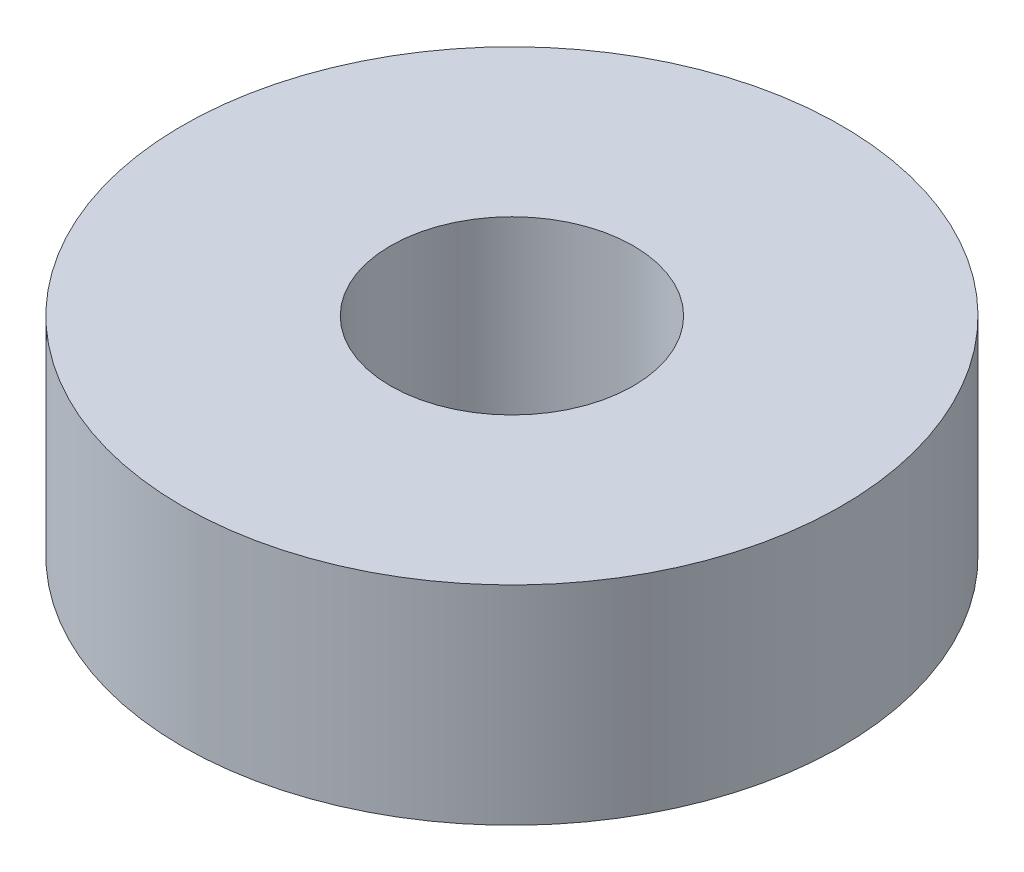
ISO-10303-21;
HEADER;
FILE_DESCRIPTION(('STEP AP214'),'2;1');
FILE_NAME('part.step','',(''),(''),'','','');
FILE_SCHEMA(('AUTOMOTIVE_DESIGN { 1 0 10303 214 1 1 1 1 }'));
ENDSEC;
DATA;
#1=APPLICATION_CONTEXT('core data for automotive mechanical design processes');
#2=APPLICATION_PROTOCOL_DEFINITION('international standard','automotive_design',2000,#1);
#3=PRODUCT_CONTEXT('',#1,'mechanical');
#4=PRODUCT('Part','Part','',(#3));
#5=PRODUCT_RELATED_PRODUCT_CATEGORY('part','',(#4));
#6=PRODUCT_DEFINITION_FORMATION('','',#4);
#7=PRODUCT_DEFINITION_CONTEXT('part definition',#1,'design');
#8=PRODUCT_DEFINITION('design','',#6,#7);
#9=PRODUCT_DEFINITION_SHAPE('','',#8);
#10=(LENGTH_UNIT() NAMED_UNIT(*) SI_UNIT(.MILLI.,.METRE.));
#11=(NAMED_UNIT(*) PLANE_ANGLE_UNIT() SI_UNIT($,.RADIAN.));
#12=(NAMED_UNIT(*) SI_UNIT($,.STERADIAN.) SOLID_ANGLE_UNIT());
#13=UNCERTAINTY_MEASURE_WITH_UNIT(LENGTH_MEASURE(1.E-05),#10,'distance_accuracy_value','');
#14=(GEOMETRIC_REPRESENTATION_CONTEXT(3) GLOBAL_UNCERTAINTY_ASSIGNED_CONTEXT((#13)) GLOBAL_UNIT_ASSIGNED_CONTEXT((#10,
#11,#12)) REPRESENTATION_CONTEXT('',''));
#15=CARTESIAN_POINT('',(0.,0.,0.));
#16=DIRECTION('',(0.,0.,1.));
#17=DIRECTION('',(1.,0.,0.));
#18=AXIS2_PLACEMENT_3D('',#15,#16,#17);
#19=CARTESIAN_POINT('',(0.,6.,0.));
#20=DIRECTION('',(0.,1.,0.));
#21=DIRECTION('',(0.,0.,1.));
#22=AXIS2_PLACEMENT_3D('',#19,#20,#21);
#23=PLANE('',#22);
#24=CARTESIAN_POINT('',(0.,6.,0.));
#25=DIRECTION('',(0.,1.,0.));
#26=DIRECTION('',(0.,0.,1.));
#27=AXIS2_PLACEMENT_3D('',#24,#25,#26);
#28=CIRCLE('',#27,9.5);
#29=CARTESIAN_POINT('',(0.,6.,9.5));
#30=VERTEX_POINT('',#29);
#31=EDGE_CURVE('E10',#30,#30,#28,.T.);
#32=ORIENTED_EDGE('',*,*,#31,.T.);
#33=EDGE_LOOP('',(#32));
#34=FACE_BOUND('',#33,.T.);
#35=CARTESIAN_POINT('',(0.,6.,0.));
#36=DIRECTION('',(0.,1.,0.));
#37=DIRECTION('',(0.,0.,1.));
#38=AXIS2_PLACEMENT_3D('',#35,#36,#37);
#39=CIRCLE('',#38,3.5);
#40=CARTESIAN_POINT('',(0.,6.,3.5));
#41=VERTEX_POINT('',#40);
#42=EDGE_CURVE('E46',#41,#41,#39,.T.);
#43=ORIENTED_EDGE('',*,*,#42,.F.);
#44=EDGE_LOOP('',(#43));
#45=FACE_BOUND('',#44,.T.);
#46=ADVANCED_FACE('F35',(#34,#45),#23,.T.);
#47=CARTESIAN_POINT('',(0.,0.,0.));
#48=DIRECTION('',(0.,1.,0.));
#49=DIRECTION('',(0.,0.,1.));
#50=AXIS2_PLACEMENT_3D('',#47,#48,#49);
#51=PLANE('',#50);
#52=CARTESIAN_POINT('',(0.,0.,0.));
#53=DIRECTION('',(0.,1.,0.));
#54=DIRECTION('',(0.,0.,1.));
#55=AXIS2_PLACEMENT_3D('',#52,#53,#54);
#56=CIRCLE('',#55,9.5);
#57=CARTESIAN_POINT('',(0.,0.,9.5));
#58=VERTEX_POINT('',#57);
#59=EDGE_CURVE('E39',#58,#58,#56,.T.);
#60=ORIENTED_EDGE('',*,*,#59,.F.);
#61=EDGE_LOOP('',(#60));
#62=FACE_BOUND('',#61,.T.);
#63=CARTESIAN_POINT('',(0.,0.,0.));
#64=DIRECTION('',(0.,1.,0.));
#65=DIRECTION('',(0.,0.,1.));
#66=AXIS2_PLACEMENT_3D('',#63,#64,#65);
#67=CIRCLE('',#66,3.5);
#68=CARTESIAN_POINT('',(0.,0.,3.5));
#69=VERTEX_POINT('',#68);
#70=EDGE_CURVE('E48',#69,#69,#67,.T.);
#71=ORIENTED_EDGE('',*,*,#70,.T.);
#72=EDGE_LOOP('',(#71));
#73=FACE_BOUND('',#72,.T.);
#74=ADVANCED_FACE('F58',(#62,#73),#51,.F.);
#75=CARTESIAN_POINT('',(0.,6.,0.));
#76=DIRECTION('',(0.,-1.,0.));
#77=DIRECTION('',(0.,0.,-1.));
#78=AXIS2_PLACEMENT_3D('',#75,#76,#77);
#79=CYLINDRICAL_SURFACE('',#78,9.5);
#80=ORIENTED_EDGE('',*,*,#31,.F.);
#81=EDGE_LOOP('',(#80));
#82=FACE_BOUND('',#81,.T.);
#83=ORIENTED_EDGE('',*,*,#59,.T.);
#84=EDGE_LOOP('',(#83));
#85=FACE_BOUND('',#84,.T.);
#86=ADVANCED_FACE('F37',(#82,#85),#79,.T.);
#87=CARTESIAN_POINT('',(0.,6.,0.));
#88=DIRECTION('',(0.,-1.,0.));
#89=DIRECTION('',(0.,0.,-1.));
#90=AXIS2_PLACEMENT_3D('',#87,#88,#89);
#91=CYLINDRICAL_SURFACE('',#90,3.5);
#92=ORIENTED_EDGE('',*,*,#42,.T.);
#93=EDGE_LOOP('',(#92));
#94=FACE_BOUND('',#93,.T.);
#95=ORIENTED_EDGE('',*,*,#70,.F.);
#96=EDGE_LOOP('',(#95));
#97=FACE_BOUND('',#96,.T.);
#98=ADVANCED_FACE('F54',(#94,#97),#91,.F.);
#99=CLOSED_SHELL('',(#46,#74,#86,#98));
#100=MANIFOLD_SOLID_BREP('B2',#99);
#101=ADVANCED_BREP_SHAPE_REPRESENTATION('',(#18,#100),#14);
#102=SHAPE_DEFINITION_REPRESENTATION(#9,#101);
ENDSEC;
END-ISO-10303-21;
